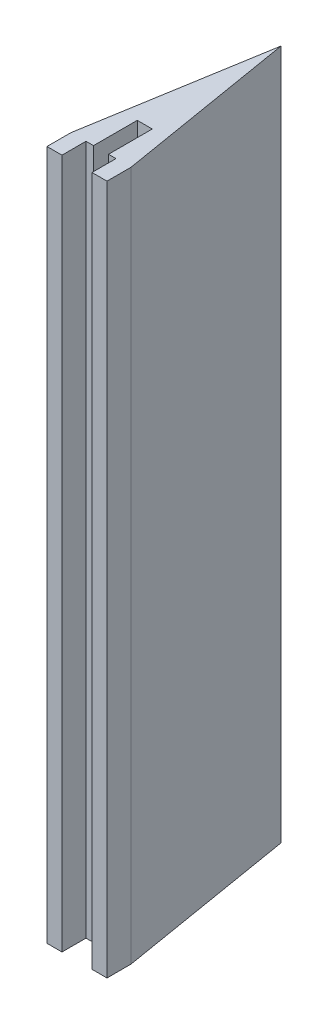
ISO-10303-21;
HEADER;
FILE_DESCRIPTION(('STEP AP214'),'2;1');
FILE_NAME('part.step','',(''),(''),'','','');
FILE_SCHEMA(('AUTOMOTIVE_DESIGN { 1 0 10303 214 1 1 1 1 }'));
ENDSEC;
DATA;
#1=APPLICATION_CONTEXT('core data for automotive mechanical design processes');
#2=APPLICATION_PROTOCOL_DEFINITION('international standard','automotive_design',2000,#1);
#3=PRODUCT_CONTEXT('',#1,'mechanical');
#4=PRODUCT('Part','Part','',(#3));
#5=PRODUCT_RELATED_PRODUCT_CATEGORY('part','',(#4));
#6=PRODUCT_DEFINITION_FORMATION('','',#4);
#7=PRODUCT_DEFINITION_CONTEXT('part definition',#1,'design');
#8=PRODUCT_DEFINITION('design','',#6,#7);
#9=PRODUCT_DEFINITION_SHAPE('','',#8);
#10=(LENGTH_UNIT() NAMED_UNIT(*) SI_UNIT(.MILLI.,.METRE.));
#11=(NAMED_UNIT(*) PLANE_ANGLE_UNIT() SI_UNIT($,.RADIAN.));
#12=(NAMED_UNIT(*) SI_UNIT($,.STERADIAN.) SOLID_ANGLE_UNIT());
#13=UNCERTAINTY_MEASURE_WITH_UNIT(LENGTH_MEASURE(1.E-05),#10,'distance_accuracy_value','');
#14=(GEOMETRIC_REPRESENTATION_CONTEXT(3) GLOBAL_UNCERTAINTY_ASSIGNED_CONTEXT((#13)) GLOBAL_UNIT_ASSIGNED_CONTEXT((#10,
#11,#12)) REPRESENTATION_CONTEXT('',''));
#15=CARTESIAN_POINT('',(0.,0.,0.));
#16=DIRECTION('',(0.,0.,1.));
#17=DIRECTION('',(1.,0.,0.));
#18=AXIS2_PLACEMENT_3D('',#15,#16,#17);
#19=CARTESIAN_POINT('',(0.,146.05,-38.1));
#20=DIRECTION('',(-0.986393923832144,0.,0.164398987305357));
#21=DIRECTION('',(0.164398987305357,0.,0.986393923832144));
#22=AXIS2_PLACEMENT_3D('',#19,#20,#21);
#23=PLANE('',#22);
#24=DIRECTION('',(-0.164398987305357,0.,-0.986393923832144));
#25=VECTOR('',#24,1.);
#26=CARTESIAN_POINT('',(0.,0.,-38.1));
#27=LINE('',#26,#25);
#28=CARTESIAN_POINT('',(6.35,0.,0.));
#29=VERTEX_POINT('',#28);
#30=CARTESIAN_POINT('',(0.,0.,-38.1));
#31=VERTEX_POINT('',#30);
#32=EDGE_CURVE('E176',#29,#31,#27,.T.);
#33=ORIENTED_EDGE('',*,*,#32,.T.);
#34=DIRECTION('',(0.,-1.,0.));
#35=VECTOR('',#34,1.);
#36=CARTESIAN_POINT('',(0.,146.05,-38.1));
#37=LINE('',#36,#35);
#38=CARTESIAN_POINT('',(0.,146.05,-38.1));
#39=VERTEX_POINT('',#38);
#40=EDGE_CURVE('E11',#39,#31,#37,.T.);
#41=ORIENTED_EDGE('',*,*,#40,.F.);
#42=DIRECTION('',(-0.164398987305357,0.,-0.986393923832144));
#43=VECTOR('',#42,1.);
#44=CARTESIAN_POINT('',(0.,146.05,-38.1));
#45=LINE('',#44,#43);
#46=CARTESIAN_POINT('',(6.35,146.05,0.));
#47=VERTEX_POINT('',#46);
#48=EDGE_CURVE('E213',#47,#39,#45,.T.);
#49=ORIENTED_EDGE('',*,*,#48,.F.);
#50=DIRECTION('',(0.,-1.,0.));
#51=VECTOR('',#50,1.);
#52=CARTESIAN_POINT('',(6.35,146.05,0.));
#53=LINE('',#52,#51);
#54=EDGE_CURVE('E172',#47,#29,#53,.T.);
#55=ORIENTED_EDGE('',*,*,#54,.T.);
#56=EDGE_LOOP('',(#33,#41,#49,#55));
#57=FACE_BOUND('',#56,.T.);
#58=ADVANCED_FACE('F45',(#57),#23,.F.);
#59=CARTESIAN_POINT('',(0.,146.05,-38.1));
#60=DIRECTION('',(0.986393923832144,0.,0.164398987305357));
#61=DIRECTION('',(0.164398987305357,0.,-0.986393923832144));
#62=AXIS2_PLACEMENT_3D('',#59,#60,#61);
#63=PLANE('',#62);
#64=DIRECTION('',(-0.164398987305357,0.,0.986393923832144));
#65=VECTOR('',#64,1.);
#66=CARTESIAN_POINT('',(0.,0.,-38.1));
#67=LINE('',#66,#65);
#68=CARTESIAN_POINT('',(-6.35,0.,0.));
#69=VERTEX_POINT('',#68);
#70=EDGE_CURVE('E180',#31,#69,#67,.T.);
#71=ORIENTED_EDGE('',*,*,#70,.T.);
#72=DIRECTION('',(0.,-1.,0.));
#73=VECTOR('',#72,1.);
#74=CARTESIAN_POINT('',(-6.35,146.05,0.));
#75=LINE('',#74,#73);
#76=CARTESIAN_POINT('',(-6.35,146.05,0.));
#77=VERTEX_POINT('',#76);
#78=EDGE_CURVE('E54',#77,#69,#75,.T.);
#79=ORIENTED_EDGE('',*,*,#78,.F.);
#80=DIRECTION('',(-0.164398987305357,0.,0.986393923832144));
#81=VECTOR('',#80,1.);
#82=CARTESIAN_POINT('',(0.,146.05,-38.1));
#83=LINE('',#82,#81);
#84=EDGE_CURVE('E120',#39,#77,#83,.T.);
#85=ORIENTED_EDGE('',*,*,#84,.F.);
#86=ORIENTED_EDGE('',*,*,#40,.T.);
#87=EDGE_LOOP('',(#71,#79,#85,#86));
#88=FACE_BOUND('',#87,.T.);
#89=ADVANCED_FACE('F314',(#88),#63,.F.);
#90=CARTESIAN_POINT('',(-6.35,146.05,5.08));
#91=DIRECTION('',(1.,0.,0.));
#92=DIRECTION('',(0.,0.,-1.));
#93=AXIS2_PLACEMENT_3D('',#90,#91,#92);
#94=PLANE('',#93);
#95=DIRECTION('',(0.,0.,1.));
#96=VECTOR('',#95,1.);
#97=CARTESIAN_POINT('',(-6.35,0.,5.08));
#98=LINE('',#97,#96);
#99=CARTESIAN_POINT('',(-6.35,0.,5.08));
#100=VERTEX_POINT('',#99);
#101=EDGE_CURVE('E183',#69,#100,#98,.T.);
#102=ORIENTED_EDGE('',*,*,#101,.T.);
#103=DIRECTION('',(0.,-1.,0.));
#104=VECTOR('',#103,1.);
#105=CARTESIAN_POINT('',(-6.35,146.05,5.08));
#106=LINE('',#105,#104);
#107=CARTESIAN_POINT('',(-6.35,146.05,5.08));
#108=VERTEX_POINT('',#107);
#109=EDGE_CURVE('E244',#108,#100,#106,.T.);
#110=ORIENTED_EDGE('',*,*,#109,.F.);
#111=DIRECTION('',(0.,0.,1.));
#112=VECTOR('',#111,1.);
#113=CARTESIAN_POINT('',(-6.35,146.05,5.08));
#114=LINE('',#113,#112);
#115=EDGE_CURVE('E254',#77,#108,#114,.T.);
#116=ORIENTED_EDGE('',*,*,#115,.F.);
#117=ORIENTED_EDGE('',*,*,#78,.T.);
#118=EDGE_LOOP('',(#102,#110,#116,#117));
#119=FACE_BOUND('',#118,.T.);
#120=ADVANCED_FACE('F252',(#119),#94,.F.);
#121=CARTESIAN_POINT('',(-3.175,146.05,5.08));
#122=DIRECTION('',(0.,0.,-1.));
#123=DIRECTION('',(-1.,0.,0.));
#124=AXIS2_PLACEMENT_3D('',#121,#122,#123);
#125=PLANE('',#124);
#126=DIRECTION('',(1.,0.,0.));
#127=VECTOR('',#126,1.);
#128=CARTESIAN_POINT('',(-3.175,0.,5.08));
#129=LINE('',#128,#127);
#130=CARTESIAN_POINT('',(-3.175,0.,5.08));
#131=VERTEX_POINT('',#130);
#132=EDGE_CURVE('E186',#100,#131,#129,.T.);
#133=ORIENTED_EDGE('',*,*,#132,.T.);
#134=DIRECTION('',(0.,-1.,0.));
#135=VECTOR('',#134,1.);
#136=CARTESIAN_POINT('',(-3.175,146.05,5.08));
#137=LINE('',#136,#135);
#138=CARTESIAN_POINT('',(-3.175,146.05,5.08));
#139=VERTEX_POINT('',#138);
#140=EDGE_CURVE('E240',#139,#131,#137,.T.);
#141=ORIENTED_EDGE('',*,*,#140,.F.);
#142=DIRECTION('',(1.,0.,0.));
#143=VECTOR('',#142,1.);
#144=CARTESIAN_POINT('',(-3.175,146.05,5.08));
#145=LINE('',#144,#143);
#146=EDGE_CURVE('E273',#108,#139,#145,.T.);
#147=ORIENTED_EDGE('',*,*,#146,.F.);
#148=ORIENTED_EDGE('',*,*,#109,.T.);
#149=EDGE_LOOP('',(#133,#141,#147,#148));
#150=FACE_BOUND('',#149,.T.);
#151=ADVANCED_FACE('F263',(#150),#125,.F.);
#152=CARTESIAN_POINT('',(-3.175,146.05,0.));
#153=DIRECTION('',(-1.,0.,0.));
#154=DIRECTION('',(0.,0.,1.));
#155=AXIS2_PLACEMENT_3D('',#152,#153,#154);
#156=PLANE('',#155);
#157=DIRECTION('',(0.,0.,-1.));
#158=VECTOR('',#157,1.);
#159=CARTESIAN_POINT('',(-3.175,0.,0.));
#160=LINE('',#159,#158);
#161=CARTESIAN_POINT('',(-3.175,0.,0.));
#162=VERTEX_POINT('',#161);
#163=EDGE_CURVE('E189',#131,#162,#160,.T.);
#164=ORIENTED_EDGE('',*,*,#163,.T.);
#165=DIRECTION('',(0.,-1.,0.));
#166=VECTOR('',#165,1.);
#167=CARTESIAN_POINT('',(-3.175,146.05,0.));
#168=LINE('',#167,#166);
#169=CARTESIAN_POINT('',(-3.175,146.05,0.));
#170=VERTEX_POINT('',#169);
#171=EDGE_CURVE('E236',#170,#162,#168,.T.);
#172=ORIENTED_EDGE('',*,*,#171,.F.);
#173=DIRECTION('',(0.,0.,-1.));
#174=VECTOR('',#173,1.);
#175=CARTESIAN_POINT('',(-3.175,146.05,0.));
#176=LINE('',#175,#174);
#177=EDGE_CURVE('E269',#139,#170,#176,.T.);
#178=ORIENTED_EDGE('',*,*,#177,.F.);
#179=ORIENTED_EDGE('',*,*,#140,.T.);
#180=EDGE_LOOP('',(#164,#172,#178,#179));
#181=FACE_BOUND('',#180,.T.);
#182=ADVANCED_FACE('F267',(#181),#156,.F.);
#183=CARTESIAN_POINT('',(-3.175,146.05,0.));
#184=DIRECTION('',(0.,0.,-1.));
#185=DIRECTION('',(-1.,0.,0.));
#186=AXIS2_PLACEMENT_3D('',#183,#184,#185);
#187=PLANE('',#186);
#188=DIRECTION('',(1.,0.,0.));
#189=VECTOR('',#188,1.);
#190=CARTESIAN_POINT('',(-3.175,0.,0.));
#191=LINE('',#190,#189);
#192=CARTESIAN_POINT('',(-1.5875,0.,0.));
#193=VERTEX_POINT('',#192);
#194=EDGE_CURVE('E192',#162,#193,#191,.T.);
#195=ORIENTED_EDGE('',*,*,#194,.T.);
#196=DIRECTION('',(0.,-1.,0.));
#197=VECTOR('',#196,1.);
#198=CARTESIAN_POINT('',(-1.5875,146.05,0.));
#199=LINE('',#198,#197);
#200=CARTESIAN_POINT('',(-1.5875,146.05,0.));
#201=VERTEX_POINT('',#200);
#202=EDGE_CURVE('E232',#201,#193,#199,.T.);
#203=ORIENTED_EDGE('',*,*,#202,.F.);
#204=DIRECTION('',(1.,0.,0.));
#205=VECTOR('',#204,1.);
#206=CARTESIAN_POINT('',(-3.175,146.05,0.));
#207=LINE('',#206,#205);
#208=EDGE_CURVE('E272',#170,#201,#207,.T.);
#209=ORIENTED_EDGE('',*,*,#208,.F.);
#210=ORIENTED_EDGE('',*,*,#171,.T.);
#211=EDGE_LOOP('',(#195,#203,#209,#210));
#212=FACE_BOUND('',#211,.T.);
#213=ADVANCED_FACE('F327',(#212),#187,.F.);
#214=CARTESIAN_POINT('',(-1.5875,146.05,0.));
#215=DIRECTION('',(-1.,0.,0.));
#216=DIRECTION('',(0.,0.,1.));
#217=AXIS2_PLACEMENT_3D('',#214,#215,#216);
#218=PLANE('',#217);
#219=DIRECTION('',(0.,0.,-1.));
#220=VECTOR('',#219,1.);
#221=CARTESIAN_POINT('',(-1.5875,0.,0.));
#222=LINE('',#221,#220);
#223=CARTESIAN_POINT('',(-1.5875,0.,-9.26222896630315));
#224=VERTEX_POINT('',#223);
#225=EDGE_CURVE('E195',#193,#224,#222,.T.);
#226=ORIENTED_EDGE('',*,*,#225,.T.);
#227=DIRECTION('',(0.,-1.,0.));
#228=VECTOR('',#227,1.);
#229=CARTESIAN_POINT('',(-1.5875,146.05,-9.26222896630315));
#230=LINE('',#229,#228);
#231=CARTESIAN_POINT('',(-1.5875,146.05,-9.26222896630315));
#232=VERTEX_POINT('',#231);
#233=EDGE_CURVE('E228',#232,#224,#230,.T.);
#234=ORIENTED_EDGE('',*,*,#233,.F.);
#235=DIRECTION('',(0.,0.,-1.));
#236=VECTOR('',#235,1.);
#237=CARTESIAN_POINT('',(-1.5875,146.05,0.));
#238=LINE('',#237,#236);
#239=EDGE_CURVE('E277',#201,#232,#238,.T.);
#240=ORIENTED_EDGE('',*,*,#239,.F.);
#241=ORIENTED_EDGE('',*,*,#202,.T.);
#242=EDGE_LOOP('',(#226,#234,#240,#241));
#243=FACE_BOUND('',#242,.T.);
#244=ADVANCED_FACE('F330',(#243),#218,.F.);
#245=CARTESIAN_POINT('',(-1.5875,146.05,-9.26222896630315));
#246=DIRECTION('',(0.,0.,-1.));
#247=DIRECTION('',(-1.,0.,0.));
#248=AXIS2_PLACEMENT_3D('',#245,#246,#247);
#249=PLANE('',#248);
#250=DIRECTION('',(1.,0.,0.));
#251=VECTOR('',#250,1.);
#252=CARTESIAN_POINT('',(-1.5875,0.,-9.26222896630315));
#253=LINE('',#252,#251);
#254=CARTESIAN_POINT('',(1.5875,0.,-9.26222896630315));
#255=VERTEX_POINT('',#254);
#256=EDGE_CURVE('E198',#224,#255,#253,.T.);
#257=ORIENTED_EDGE('',*,*,#256,.T.);
#258=DIRECTION('',(0.,-1.,0.));
#259=VECTOR('',#258,1.);
#260=CARTESIAN_POINT('',(1.5875,146.05,-9.26222896630315));
#261=LINE('',#260,#259);
#262=CARTESIAN_POINT('',(1.5875,146.05,-9.26222896630315));
#263=VERTEX_POINT('',#262);
#264=EDGE_CURVE('E224',#263,#255,#261,.T.);
#265=ORIENTED_EDGE('',*,*,#264,.F.);
#266=DIRECTION('',(1.,0.,0.));
#267=VECTOR('',#266,1.);
#268=CARTESIAN_POINT('',(-1.5875,146.05,-9.26222896630315));
#269=LINE('',#268,#267);
#270=EDGE_CURVE('E284',#232,#263,#269,.T.);
#271=ORIENTED_EDGE('',*,*,#270,.F.);
#272=ORIENTED_EDGE('',*,*,#233,.T.);
#273=EDGE_LOOP('',(#257,#265,#271,#272));
#274=FACE_BOUND('',#273,.T.);
#275=ADVANCED_FACE('F334',(#274),#249,.F.);
#276=CARTESIAN_POINT('',(1.5875,146.05,-9.26222896630315));
#277=DIRECTION('',(1.,0.,0.));
#278=DIRECTION('',(0.,0.,-1.));
#279=AXIS2_PLACEMENT_3D('',#276,#277,#278);
#280=PLANE('',#279);
#281=DIRECTION('',(0.,0.,1.));
#282=VECTOR('',#281,1.);
#283=CARTESIAN_POINT('',(1.5875,0.,-9.26222896630315));
#284=LINE('',#283,#282);
#285=CARTESIAN_POINT('',(1.5875,0.,0.));
#286=VERTEX_POINT('',#285);
#287=EDGE_CURVE('E201',#255,#286,#284,.T.);
#288=ORIENTED_EDGE('',*,*,#287,.T.);
#289=DIRECTION('',(0.,-1.,0.));
#290=VECTOR('',#289,1.);
#291=CARTESIAN_POINT('',(1.5875,146.05,0.));
#292=LINE('',#291,#290);
#293=CARTESIAN_POINT('',(1.5875,146.05,0.));
#294=VERTEX_POINT('',#293);
#295=EDGE_CURVE('E220',#294,#286,#292,.T.);
#296=ORIENTED_EDGE('',*,*,#295,.F.);
#297=DIRECTION('',(0.,0.,1.));
#298=VECTOR('',#297,1.);
#299=CARTESIAN_POINT('',(1.5875,146.05,-9.26222896630315));
#300=LINE('',#299,#298);
#301=EDGE_CURVE('E287',#263,#294,#300,.T.);
#302=ORIENTED_EDGE('',*,*,#301,.F.);
#303=ORIENTED_EDGE('',*,*,#264,.T.);
#304=EDGE_LOOP('',(#288,#296,#302,#303));
#305=FACE_BOUND('',#304,.T.);
#306=ADVANCED_FACE('F295',(#305),#280,.F.);
#307=CARTESIAN_POINT('',(1.5875,146.05,0.));
#308=DIRECTION('',(0.,0.,-1.));
#309=DIRECTION('',(-1.,0.,0.));
#310=AXIS2_PLACEMENT_3D('',#307,#308,#309);
#311=PLANE('',#310);
#312=DIRECTION('',(1.,0.,0.));
#313=VECTOR('',#312,1.);
#314=CARTESIAN_POINT('',(1.5875,0.,0.));
#315=LINE('',#314,#313);
#316=CARTESIAN_POINT('',(3.175,0.,0.));
#317=VERTEX_POINT('',#316);
#318=EDGE_CURVE('E204',#286,#317,#315,.T.);
#319=ORIENTED_EDGE('',*,*,#318,.T.);
#320=DIRECTION('',(0.,-1.,0.));
#321=VECTOR('',#320,1.);
#322=CARTESIAN_POINT('',(3.175,146.05,0.));
#323=LINE('',#322,#321);
#324=CARTESIAN_POINT('',(3.175,146.05,0.));
#325=VERTEX_POINT('',#324);
#326=EDGE_CURVE('E165',#325,#317,#323,.T.);
#327=ORIENTED_EDGE('',*,*,#326,.F.);
#328=DIRECTION('',(1.,0.,0.));
#329=VECTOR('',#328,1.);
#330=CARTESIAN_POINT('',(1.5875,146.05,0.));
#331=LINE('',#330,#329);
#332=EDGE_CURVE('E154',#294,#325,#331,.T.);
#333=ORIENTED_EDGE('',*,*,#332,.F.);
#334=ORIENTED_EDGE('',*,*,#295,.T.);
#335=EDGE_LOOP('',(#319,#327,#333,#334));
#336=FACE_BOUND('',#335,.T.);
#337=ADVANCED_FACE('F299',(#336),#311,.F.);
#338=CARTESIAN_POINT('',(3.175,146.05,0.));
#339=DIRECTION('',(1.,0.,0.));
#340=DIRECTION('',(0.,0.,-1.));
#341=AXIS2_PLACEMENT_3D('',#338,#339,#340);
#342=PLANE('',#341);
#343=DIRECTION('',(0.,0.,1.));
#344=VECTOR('',#343,1.);
#345=CARTESIAN_POINT('',(3.175,0.,0.));
#346=LINE('',#345,#344);
#347=CARTESIAN_POINT('',(3.175,0.,5.08));
#348=VERTEX_POINT('',#347);
#349=EDGE_CURVE('E163',#317,#348,#346,.T.);
#350=ORIENTED_EDGE('',*,*,#349,.T.);
#351=DIRECTION('',(0.,-1.,0.));
#352=VECTOR('',#351,1.);
#353=CARTESIAN_POINT('',(3.175,146.05,5.08));
#354=LINE('',#353,#352);
#355=CARTESIAN_POINT('',(3.175,146.05,5.08));
#356=VERTEX_POINT('',#355);
#357=EDGE_CURVE('E160',#356,#348,#354,.T.);
#358=ORIENTED_EDGE('',*,*,#357,.F.);
#359=DIRECTION('',(0.,0.,1.));
#360=VECTOR('',#359,1.);
#361=CARTESIAN_POINT('',(3.175,146.05,0.));
#362=LINE('',#361,#360);
#363=EDGE_CURVE('E148',#325,#356,#362,.T.);
#364=ORIENTED_EDGE('',*,*,#363,.F.);
#365=ORIENTED_EDGE('',*,*,#326,.T.);
#366=EDGE_LOOP('',(#350,#358,#364,#365));
#367=FACE_BOUND('',#366,.T.);
#368=ADVANCED_FACE('F161',(#367),#342,.F.);
#369=CARTESIAN_POINT('',(3.175,146.05,5.08));
#370=DIRECTION('',(0.,0.,-1.));
#371=DIRECTION('',(-1.,0.,0.));
#372=AXIS2_PLACEMENT_3D('',#369,#370,#371);
#373=PLANE('',#372);
#374=DIRECTION('',(1.,0.,0.));
#375=VECTOR('',#374,1.);
#376=CARTESIAN_POINT('',(3.175,0.,5.08));
#377=LINE('',#376,#375);
#378=CARTESIAN_POINT('',(6.35,0.,5.08));
#379=VERTEX_POINT('',#378);
#380=EDGE_CURVE('E106',#348,#379,#377,.T.);
#381=ORIENTED_EDGE('',*,*,#380,.T.);
#382=DIRECTION('',(0.,-1.,0.));
#383=VECTOR('',#382,1.);
#384=CARTESIAN_POINT('',(6.35,146.05,5.08));
#385=LINE('',#384,#383);
#386=CARTESIAN_POINT('',(6.35,146.05,5.08));
#387=VERTEX_POINT('',#386);
#388=EDGE_CURVE('E166',#387,#379,#385,.T.);
#389=ORIENTED_EDGE('',*,*,#388,.F.);
#390=DIRECTION('',(1.,0.,0.));
#391=VECTOR('',#390,1.);
#392=CARTESIAN_POINT('',(3.175,146.05,5.08));
#393=LINE('',#392,#391);
#394=EDGE_CURVE('E152',#356,#387,#393,.T.);
#395=ORIENTED_EDGE('',*,*,#394,.F.);
#396=ORIENTED_EDGE('',*,*,#357,.T.);
#397=EDGE_LOOP('',(#381,#389,#395,#396));
#398=FACE_BOUND('',#397,.T.);
#399=ADVANCED_FACE('F168',(#398),#373,.F.);
#400=CARTESIAN_POINT('',(6.35,146.05,5.08));
#401=DIRECTION('',(-1.,0.,0.));
#402=DIRECTION('',(0.,0.,1.));
#403=AXIS2_PLACEMENT_3D('',#400,#401,#402);
#404=PLANE('',#403);
#405=DIRECTION('',(0.,0.,-1.));
#406=VECTOR('',#405,1.);
#407=CARTESIAN_POINT('',(6.35,0.,5.08));
#408=LINE('',#407,#406);
#409=EDGE_CURVE('E112',#379,#29,#408,.T.);
#410=ORIENTED_EDGE('',*,*,#409,.T.);
#411=ORIENTED_EDGE('',*,*,#54,.F.);
#412=DIRECTION('',(0.,0.,-1.));
#413=VECTOR('',#412,1.);
#414=CARTESIAN_POINT('',(6.35,146.05,5.08));
#415=LINE('',#414,#413);
#416=EDGE_CURVE('E62',#387,#47,#415,.T.);
#417=ORIENTED_EDGE('',*,*,#416,.F.);
#418=ORIENTED_EDGE('',*,*,#388,.T.);
#419=EDGE_LOOP('',(#410,#411,#417,#418));
#420=FACE_BOUND('',#419,.T.);
#421=ADVANCED_FACE('F303',(#420),#404,.F.);
#422=CARTESIAN_POINT('',(0.,146.05,0.));
#423=DIRECTION('',(0.,1.,0.));
#424=DIRECTION('',(0.,0.,1.));
#425=AXIS2_PLACEMENT_3D('',#422,#423,#424);
#426=PLANE('',#425);
#427=ORIENTED_EDGE('',*,*,#48,.T.);
#428=ORIENTED_EDGE('',*,*,#84,.T.);
#429=ORIENTED_EDGE('',*,*,#115,.T.);
#430=ORIENTED_EDGE('',*,*,#146,.T.);
#431=ORIENTED_EDGE('',*,*,#177,.T.);
#432=ORIENTED_EDGE('',*,*,#208,.T.);
#433=ORIENTED_EDGE('',*,*,#239,.T.);
#434=ORIENTED_EDGE('',*,*,#270,.T.);
#435=ORIENTED_EDGE('',*,*,#301,.T.);
#436=ORIENTED_EDGE('',*,*,#332,.T.);
#437=ORIENTED_EDGE('',*,*,#363,.T.);
#438=ORIENTED_EDGE('',*,*,#394,.T.);
#439=ORIENTED_EDGE('',*,*,#416,.T.);
#440=EDGE_LOOP('',(#427,#428,#429,#430,#431,#432,#433,#434,#435,#436,#437,#438,#439));
#441=FACE_BOUND('',#440,.T.);
#442=ADVANCED_FACE('F150',(#441),#426,.T.);
#443=CARTESIAN_POINT('',(0.,0.,0.));
#444=DIRECTION('',(0.,1.,0.));
#445=DIRECTION('',(0.,0.,1.));
#446=AXIS2_PLACEMENT_3D('',#443,#444,#445);
#447=PLANE('',#446);
#448=ORIENTED_EDGE('',*,*,#32,.F.);
#449=ORIENTED_EDGE('',*,*,#409,.F.);
#450=ORIENTED_EDGE('',*,*,#380,.F.);
#451=ORIENTED_EDGE('',*,*,#349,.F.);
#452=ORIENTED_EDGE('',*,*,#318,.F.);
#453=ORIENTED_EDGE('',*,*,#287,.F.);
#454=ORIENTED_EDGE('',*,*,#256,.F.);
#455=ORIENTED_EDGE('',*,*,#225,.F.);
#456=ORIENTED_EDGE('',*,*,#194,.F.);
#457=ORIENTED_EDGE('',*,*,#163,.F.);
#458=ORIENTED_EDGE('',*,*,#132,.F.);
#459=ORIENTED_EDGE('',*,*,#101,.F.);
#460=ORIENTED_EDGE('',*,*,#70,.F.);
#461=EDGE_LOOP('',(#448,#449,#450,#451,#452,#453,#454,#455,#456,#457,#458,#459,#460));
#462=FACE_BOUND('',#461,.T.);
#463=ADVANCED_FACE('F258',(#462),#447,.F.);
#464=CLOSED_SHELL('',(#58,#89,#120,#151,#182,#213,#244,#275,#306,#337,#368,#399,#421,#442,#463));
#465=MANIFOLD_SOLID_BREP('B2',#464);
#466=ADVANCED_BREP_SHAPE_REPRESENTATION('',(#18,#465),#14);
#467=SHAPE_DEFINITION_REPRESENTATION(#9,#466);
ENDSEC;
END-ISO-10303-21;
